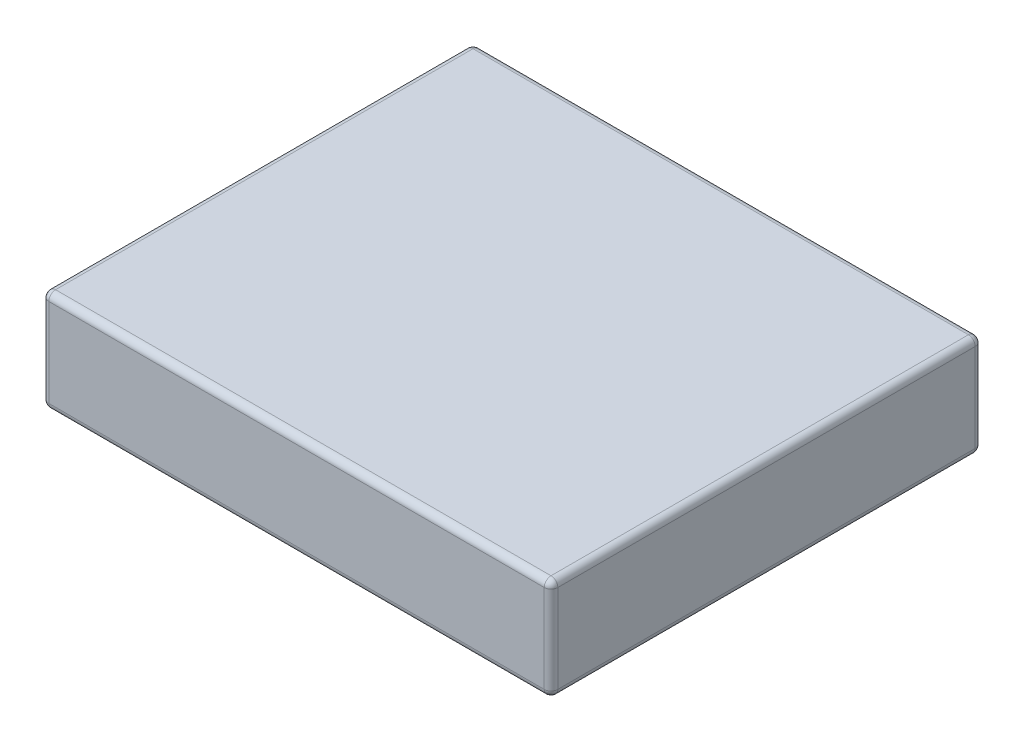
ISO-10303-21;
HEADER;
FILE_DESCRIPTION(('STEP AP214'),'2;1');
FILE_NAME('part.step','',(''),(''),'','','');
FILE_SCHEMA(('AUTOMOTIVE_DESIGN { 1 0 10303 214 1 1 1 1 }'));
ENDSEC;
DATA;
#1=APPLICATION_CONTEXT('core data for automotive mechanical design processes');
#2=APPLICATION_PROTOCOL_DEFINITION('international standard','automotive_design',2000,#1);
#3=PRODUCT_CONTEXT('',#1,'mechanical');
#4=PRODUCT('Part','Part','',(#3));
#5=PRODUCT_RELATED_PRODUCT_CATEGORY('part','',(#4));
#6=PRODUCT_DEFINITION_FORMATION('','',#4);
#7=PRODUCT_DEFINITION_CONTEXT('part definition',#1,'design');
#8=PRODUCT_DEFINITION('design','',#6,#7);
#9=PRODUCT_DEFINITION_SHAPE('','',#8);
#10=(LENGTH_UNIT() NAMED_UNIT(*) SI_UNIT(.MILLI.,.METRE.));
#11=(NAMED_UNIT(*) PLANE_ANGLE_UNIT() SI_UNIT($,.RADIAN.));
#12=(NAMED_UNIT(*) SI_UNIT($,.STERADIAN.) SOLID_ANGLE_UNIT());
#13=UNCERTAINTY_MEASURE_WITH_UNIT(LENGTH_MEASURE(1.E-05),#10,'distance_accuracy_value','');
#14=(GEOMETRIC_REPRESENTATION_CONTEXT(3) GLOBAL_UNCERTAINTY_ASSIGNED_CONTEXT((#13)) GLOBAL_UNIT_ASSIGNED_CONTEXT((#10,
#11,#12)) REPRESENTATION_CONTEXT('',''));
#15=CARTESIAN_POINT('',(0.,0.,0.));
#16=DIRECTION('',(0.,0.,1.));
#17=DIRECTION('',(1.,0.,0.));
#18=AXIS2_PLACEMENT_3D('',#15,#16,#17);
#19=CARTESIAN_POINT('',(-15.,-3.,-12.7));
#20=DIRECTION('',(-1.,0.,0.));
#21=DIRECTION('',(0.,0.,1.));
#22=AXIS2_PLACEMENT_3D('',#19,#20,#21);
#23=PLANE('',#22);
#24=DIRECTION('',(0.,1.,0.));
#25=VECTOR('',#24,1.);
#26=CARTESIAN_POINT('',(-15.,-3.,12.3));
#27=LINE('',#26,#25);
#28=CARTESIAN_POINT('',(-15.,-2.6,12.3));
#29=VERTEX_POINT('',#28);
#30=CARTESIAN_POINT('',(-15.,2.6,12.3));
#31=VERTEX_POINT('',#30);
#32=EDGE_CURVE('E140',#29,#31,#27,.T.);
#33=ORIENTED_EDGE('',*,*,#32,.T.);
#34=DIRECTION('',(0.,0.,1.));
#35=VECTOR('',#34,1.);
#36=CARTESIAN_POINT('',(-15.,2.6,-12.7));
#37=LINE('',#36,#35);
#38=CARTESIAN_POINT('',(-15.,2.6,-12.3));
#39=VERTEX_POINT('',#38);
#40=EDGE_CURVE('E188',#31,#39,#37,.F.);
#41=ORIENTED_EDGE('',*,*,#40,.T.);
#42=DIRECTION('',(0.,1.,0.));
#43=VECTOR('',#42,1.);
#44=CARTESIAN_POINT('',(-15.,-3.,-12.3));
#45=LINE('',#44,#43);
#46=CARTESIAN_POINT('',(-15.,-2.6,-12.3));
#47=VERTEX_POINT('',#46);
#48=EDGE_CURVE('E185',#39,#47,#45,.F.);
#49=ORIENTED_EDGE('',*,*,#48,.T.);
#50=DIRECTION('',(0.,0.,1.));
#51=VECTOR('',#50,1.);
#52=CARTESIAN_POINT('',(-15.,-2.6,12.7));
#53=LINE('',#52,#51);
#54=EDGE_CURVE('E182',#47,#29,#53,.T.);
#55=ORIENTED_EDGE('',*,*,#54,.T.);
#56=EDGE_LOOP('',(#33,#41,#49,#55));
#57=FACE_BOUND('',#56,.T.);
#58=ADVANCED_FACE('F33',(#57),#23,.T.);
#59=CARTESIAN_POINT('',(-15.,-3.,-12.7));
#60=DIRECTION('',(0.,0.,-1.));
#61=DIRECTION('',(-1.,0.,0.));
#62=AXIS2_PLACEMENT_3D('',#59,#60,#61);
#63=PLANE('',#62);
#64=DIRECTION('',(0.,1.,0.));
#65=VECTOR('',#64,1.);
#66=CARTESIAN_POINT('',(-14.6,-3.,-12.7));
#67=LINE('',#66,#65);
#68=CARTESIAN_POINT('',(-14.6,-2.6,-12.7));
#69=VERTEX_POINT('',#68);
#70=CARTESIAN_POINT('',(-14.6,2.6,-12.7));
#71=VERTEX_POINT('',#70);
#72=EDGE_CURVE('E175',#69,#71,#67,.T.);
#73=ORIENTED_EDGE('',*,*,#72,.T.);
#74=DIRECTION('',(-1.,0.,0.));
#75=VECTOR('',#74,1.);
#76=CARTESIAN_POINT('',(-15.,2.6,-12.7));
#77=LINE('',#76,#75);
#78=CARTESIAN_POINT('',(14.6,2.6,-12.7));
#79=VERTEX_POINT('',#78);
#80=EDGE_CURVE('E180',#71,#79,#77,.F.);
#81=ORIENTED_EDGE('',*,*,#80,.T.);
#82=DIRECTION('',(0.,1.,0.));
#83=VECTOR('',#82,1.);
#84=CARTESIAN_POINT('',(14.6,-3.,-12.7));
#85=LINE('',#84,#83);
#86=CARTESIAN_POINT('',(14.6,-2.6,-12.7));
#87=VERTEX_POINT('',#86);
#88=EDGE_CURVE('E177',#79,#87,#85,.F.);
#89=ORIENTED_EDGE('',*,*,#88,.T.);
#90=DIRECTION('',(-1.,0.,0.));
#91=VECTOR('',#90,1.);
#92=CARTESIAN_POINT('',(-15.,-2.6,-12.7));
#93=LINE('',#92,#91);
#94=EDGE_CURVE('E173',#87,#69,#93,.T.);
#95=ORIENTED_EDGE('',*,*,#94,.T.);
#96=EDGE_LOOP('',(#73,#81,#89,#95));
#97=FACE_BOUND('',#96,.T.);
#98=ADVANCED_FACE('F294',(#97),#63,.T.);
#99=CARTESIAN_POINT('',(15.,-3.,-12.7));
#100=DIRECTION('',(1.,0.,0.));
#101=DIRECTION('',(0.,0.,-1.));
#102=AXIS2_PLACEMENT_3D('',#99,#100,#101);
#103=PLANE('',#102);
#104=DIRECTION('',(0.,1.,0.));
#105=VECTOR('',#104,1.);
#106=CARTESIAN_POINT('',(15.,-3.,-12.3));
#107=LINE('',#106,#105);
#108=CARTESIAN_POINT('',(15.,-2.6,-12.3));
#109=VERTEX_POINT('',#108);
#110=CARTESIAN_POINT('',(15.,2.6,-12.3));
#111=VERTEX_POINT('',#110);
#112=EDGE_CURVE('E166',#109,#111,#107,.T.);
#113=ORIENTED_EDGE('',*,*,#112,.T.);
#114=DIRECTION('',(0.,0.,-1.));
#115=VECTOR('',#114,1.);
#116=CARTESIAN_POINT('',(15.,2.6,-12.7));
#117=LINE('',#116,#115);
#118=CARTESIAN_POINT('',(15.,2.6,12.3));
#119=VERTEX_POINT('',#118);
#120=EDGE_CURVE('E171',#111,#119,#117,.F.);
#121=ORIENTED_EDGE('',*,*,#120,.T.);
#122=DIRECTION('',(0.,1.,0.));
#123=VECTOR('',#122,1.);
#124=CARTESIAN_POINT('',(15.,-3.,12.3));
#125=LINE('',#124,#123);
#126=CARTESIAN_POINT('',(15.,-2.6,12.3));
#127=VERTEX_POINT('',#126);
#128=EDGE_CURVE('E168',#119,#127,#125,.F.);
#129=ORIENTED_EDGE('',*,*,#128,.T.);
#130=DIRECTION('',(0.,0.,-1.));
#131=VECTOR('',#130,1.);
#132=CARTESIAN_POINT('',(15.,-2.6,-12.7));
#133=LINE('',#132,#131);
#134=EDGE_CURVE('E164',#127,#109,#133,.T.);
#135=ORIENTED_EDGE('',*,*,#134,.T.);
#136=EDGE_LOOP('',(#113,#121,#129,#135));
#137=FACE_BOUND('',#136,.T.);
#138=ADVANCED_FACE('F285',(#137),#103,.T.);
#139=CARTESIAN_POINT('',(-15.,-3.,12.7));
#140=DIRECTION('',(0.,0.,1.));
#141=DIRECTION('',(1.,0.,0.));
#142=AXIS2_PLACEMENT_3D('',#139,#140,#141);
#143=PLANE('',#142);
#144=DIRECTION('',(0.,1.,0.));
#145=VECTOR('',#144,1.);
#146=CARTESIAN_POINT('',(14.6,-3.,12.7));
#147=LINE('',#146,#145);
#148=CARTESIAN_POINT('',(14.6,-2.6,12.7));
#149=VERTEX_POINT('',#148);
#150=CARTESIAN_POINT('',(14.6,2.6,12.7));
#151=VERTEX_POINT('',#150);
#152=EDGE_CURVE('E133',#149,#151,#147,.T.);
#153=ORIENTED_EDGE('',*,*,#152,.T.);
#154=DIRECTION('',(1.,0.,0.));
#155=VECTOR('',#154,1.);
#156=CARTESIAN_POINT('',(-15.,2.6,12.7));
#157=LINE('',#156,#155);
#158=CARTESIAN_POINT('',(-14.6,2.6,12.7));
#159=VERTEX_POINT('',#158);
#160=EDGE_CURVE('E129',#151,#159,#157,.F.);
#161=ORIENTED_EDGE('',*,*,#160,.T.);
#162=DIRECTION('',(0.,1.,0.));
#163=VECTOR('',#162,1.);
#164=CARTESIAN_POINT('',(-14.6,-3.,12.7));
#165=LINE('',#164,#163);
#166=CARTESIAN_POINT('',(-14.6,-2.6,12.7));
#167=VERTEX_POINT('',#166);
#168=EDGE_CURVE('E121',#159,#167,#165,.F.);
#169=ORIENTED_EDGE('',*,*,#168,.T.);
#170=DIRECTION('',(1.,0.,0.));
#171=VECTOR('',#170,1.);
#172=CARTESIAN_POINT('',(15.,-2.6,12.7));
#173=LINE('',#172,#171);
#174=EDGE_CURVE('E126',#167,#149,#173,.T.);
#175=ORIENTED_EDGE('',*,*,#174,.T.);
#176=EDGE_LOOP('',(#153,#161,#169,#175));
#177=FACE_BOUND('',#176,.T.);
#178=ADVANCED_FACE('F124',(#177),#143,.T.);
#179=CARTESIAN_POINT('',(0.,-3.,0.));
#180=DIRECTION('',(0.,1.,0.));
#181=DIRECTION('',(0.,0.,1.));
#182=AXIS2_PLACEMENT_3D('',#179,#180,#181);
#183=PLANE('',#182);
#184=DIRECTION('',(0.,0.,-1.));
#185=VECTOR('',#184,1.);
#186=CARTESIAN_POINT('',(14.6,-3.,12.7));
#187=LINE('',#186,#185);
#188=CARTESIAN_POINT('',(14.6,-3.,-12.3));
#189=VERTEX_POINT('',#188);
#190=CARTESIAN_POINT('',(14.6,-3.,12.3));
#191=VERTEX_POINT('',#190);
#192=EDGE_CURVE('E42',#189,#191,#187,.F.);
#193=ORIENTED_EDGE('',*,*,#192,.T.);
#194=DIRECTION('',(1.,0.,0.));
#195=VECTOR('',#194,1.);
#196=CARTESIAN_POINT('',(-15.,-3.,12.3));
#197=LINE('',#196,#195);
#198=CARTESIAN_POINT('',(-14.6,-3.,12.3));
#199=VERTEX_POINT('',#198);
#200=EDGE_CURVE('E11',#191,#199,#197,.F.);
#201=ORIENTED_EDGE('',*,*,#200,.T.);
#202=DIRECTION('',(0.,0.,1.));
#203=VECTOR('',#202,1.);
#204=CARTESIAN_POINT('',(-14.6,-3.,-12.7));
#205=LINE('',#204,#203);
#206=CARTESIAN_POINT('',(-14.6,-3.,-12.3));
#207=VERTEX_POINT('',#206);
#208=EDGE_CURVE('E199',#199,#207,#205,.F.);
#209=ORIENTED_EDGE('',*,*,#208,.T.);
#210=DIRECTION('',(-1.,0.,0.));
#211=VECTOR('',#210,1.);
#212=CARTESIAN_POINT('',(15.,-3.,-12.3));
#213=LINE('',#212,#211);
#214=EDGE_CURVE('E53',#207,#189,#213,.F.);
#215=ORIENTED_EDGE('',*,*,#214,.T.);
#216=EDGE_LOOP('',(#193,#201,#209,#215));
#217=FACE_BOUND('',#216,.T.);
#218=ADVANCED_FACE('F484',(#217),#183,.F.);
#219=CARTESIAN_POINT('',(0.,3.,0.));
#220=DIRECTION('',(0.,1.,0.));
#221=DIRECTION('',(0.,0.,1.));
#222=AXIS2_PLACEMENT_3D('',#219,#220,#221);
#223=PLANE('',#222);
#224=DIRECTION('',(0.,0.,-1.));
#225=VECTOR('',#224,1.);
#226=CARTESIAN_POINT('',(14.6,3.,0.));
#227=LINE('',#226,#225);
#228=CARTESIAN_POINT('',(14.6,3.,12.3));
#229=VERTEX_POINT('',#228);
#230=CARTESIAN_POINT('',(14.6,3.,-12.3));
#231=VERTEX_POINT('',#230);
#232=EDGE_CURVE('E194',#229,#231,#227,.T.);
#233=ORIENTED_EDGE('',*,*,#232,.T.);
#234=DIRECTION('',(-1.,0.,0.));
#235=VECTOR('',#234,1.);
#236=CARTESIAN_POINT('',(0.,3.,-12.3));
#237=LINE('',#236,#235);
#238=CARTESIAN_POINT('',(-14.6,3.,-12.3));
#239=VERTEX_POINT('',#238);
#240=EDGE_CURVE('E196',#231,#239,#237,.T.);
#241=ORIENTED_EDGE('',*,*,#240,.T.);
#242=DIRECTION('',(0.,0.,1.));
#243=VECTOR('',#242,1.);
#244=CARTESIAN_POINT('',(-14.6,3.,0.));
#245=LINE('',#244,#243);
#246=CARTESIAN_POINT('',(-14.6,3.,12.3));
#247=VERTEX_POINT('',#246);
#248=EDGE_CURVE('E190',#239,#247,#245,.T.);
#249=ORIENTED_EDGE('',*,*,#248,.T.);
#250=DIRECTION('',(1.,0.,0.));
#251=VECTOR('',#250,1.);
#252=CARTESIAN_POINT('',(0.,3.,12.3));
#253=LINE('',#252,#251);
#254=EDGE_CURVE('E192',#247,#229,#253,.T.);
#255=ORIENTED_EDGE('',*,*,#254,.T.);
#256=EDGE_LOOP('',(#233,#241,#249,#255));
#257=FACE_BOUND('',#256,.T.);
#258=ADVANCED_FACE('F267',(#257),#223,.T.);
#259=CARTESIAN_POINT('',(-14.6,-3.,-12.3));
#260=DIRECTION('',(0.,1.,0.));
#261=DIRECTION('',(0.,0.,1.));
#262=AXIS2_PLACEMENT_3D('',#259,#260,#261);
#263=CYLINDRICAL_SURFACE('',#262,0.4);
#264=CARTESIAN_POINT('',(-14.6,-2.6,-12.3));
#265=DIRECTION('',(0.,-1.,0.));
#266=DIRECTION('',(0.,0.,-1.));
#267=AXIS2_PLACEMENT_3D('',#264,#265,#266);
#268=CIRCLE('',#267,0.4);
#269=EDGE_CURVE('E37',#47,#69,#268,.T.);
#270=ORIENTED_EDGE('',*,*,#269,.F.);
#271=ORIENTED_EDGE('',*,*,#48,.F.);
#272=CARTESIAN_POINT('',(-14.6,2.6,-12.3));
#273=DIRECTION('',(0.,1.,0.));
#274=DIRECTION('',(0.,0.,1.));
#275=AXIS2_PLACEMENT_3D('',#272,#273,#274);
#276=CIRCLE('',#275,0.4);
#277=EDGE_CURVE('E160',#71,#39,#276,.T.);
#278=ORIENTED_EDGE('',*,*,#277,.F.);
#279=ORIENTED_EDGE('',*,*,#72,.F.);
#280=EDGE_LOOP('',(#270,#271,#278,#279));
#281=FACE_BOUND('',#280,.T.);
#282=ADVANCED_FACE('F35',(#281),#263,.T.);
#283=CARTESIAN_POINT('',(-14.6,-2.6,-12.3));
#284=DIRECTION('',(0.,0.,1.));
#285=DIRECTION('',(1.,0.,0.));
#286=AXIS2_PLACEMENT_3D('',#283,#284,#285);
#287=SPHERICAL_SURFACE('',#286,0.4);
#288=CARTESIAN_POINT('',(-14.6,-2.6,-12.3));
#289=DIRECTION('',(0.,0.,-1.));
#290=DIRECTION('',(-1.,0.,0.));
#291=AXIS2_PLACEMENT_3D('',#288,#289,#290);
#292=CIRCLE('',#291,0.4);
#293=EDGE_CURVE('E246',#47,#207,#292,.F.);
#294=ORIENTED_EDGE('',*,*,#293,.F.);
#295=ORIENTED_EDGE('',*,*,#269,.T.);
#296=CARTESIAN_POINT('',(-14.6,-2.6,-12.3));
#297=DIRECTION('',(-1.,0.,0.));
#298=DIRECTION('',(0.,0.,1.));
#299=AXIS2_PLACEMENT_3D('',#296,#297,#298);
#300=CIRCLE('',#299,0.4);
#301=EDGE_CURVE('E249',#207,#69,#300,.F.);
#302=ORIENTED_EDGE('',*,*,#301,.F.);
#303=EDGE_LOOP('',(#294,#295,#302));
#304=FACE_BOUND('',#303,.T.);
#305=ADVANCED_FACE('F299',(#304),#287,.T.);
#306=CARTESIAN_POINT('',(-14.6,2.6,-12.3));
#307=DIRECTION('',(0.,0.,1.));
#308=DIRECTION('',(1.,0.,0.));
#309=AXIS2_PLACEMENT_3D('',#306,#307,#308);
#310=SPHERICAL_SURFACE('',#309,0.4);
#311=CARTESIAN_POINT('',(-14.6,2.6,-12.3));
#312=DIRECTION('',(-1.,0.,0.));
#313=DIRECTION('',(0.,0.,1.));
#314=AXIS2_PLACEMENT_3D('',#311,#312,#313);
#315=CIRCLE('',#314,0.4);
#316=EDGE_CURVE('E240',#71,#239,#315,.F.);
#317=ORIENTED_EDGE('',*,*,#316,.F.);
#318=ORIENTED_EDGE('',*,*,#277,.T.);
#319=CARTESIAN_POINT('',(-14.6,2.6,-12.3));
#320=DIRECTION('',(0.,0.,-1.));
#321=DIRECTION('',(-1.,0.,0.));
#322=AXIS2_PLACEMENT_3D('',#319,#320,#321);
#323=CIRCLE('',#322,0.4);
#324=EDGE_CURVE('E243',#239,#39,#323,.F.);
#325=ORIENTED_EDGE('',*,*,#324,.F.);
#326=EDGE_LOOP('',(#317,#318,#325));
#327=FACE_BOUND('',#326,.T.);
#328=ADVANCED_FACE('F256',(#327),#310,.T.);
#329=CARTESIAN_POINT('',(-15.,-2.6,-12.3));
#330=DIRECTION('',(1.,0.,0.));
#331=DIRECTION('',(0.,0.,-1.));
#332=AXIS2_PLACEMENT_3D('',#329,#330,#331);
#333=CYLINDRICAL_SURFACE('',#332,0.4);
#334=ORIENTED_EDGE('',*,*,#301,.T.);
#335=ORIENTED_EDGE('',*,*,#94,.F.);
#336=CARTESIAN_POINT('',(14.6,-2.6,-12.3));
#337=DIRECTION('',(1.,0.,0.));
#338=DIRECTION('',(0.,0.,-1.));
#339=AXIS2_PLACEMENT_3D('',#336,#337,#338);
#340=CIRCLE('',#339,0.4);
#341=EDGE_CURVE('E235',#189,#87,#340,.T.);
#342=ORIENTED_EDGE('',*,*,#341,.F.);
#343=ORIENTED_EDGE('',*,*,#214,.F.);
#344=EDGE_LOOP('',(#334,#335,#342,#343));
#345=FACE_BOUND('',#344,.T.);
#346=ADVANCED_FACE('F301',(#345),#333,.T.);
#347=CARTESIAN_POINT('',(-14.6,-2.6,-12.7));
#348=DIRECTION('',(0.,0.,-1.));
#349=DIRECTION('',(-1.,0.,0.));
#350=AXIS2_PLACEMENT_3D('',#347,#348,#349);
#351=CYLINDRICAL_SURFACE('',#350,0.4);
#352=ORIENTED_EDGE('',*,*,#293,.T.);
#353=ORIENTED_EDGE('',*,*,#208,.F.);
#354=CARTESIAN_POINT('',(-14.6,-2.6,12.3));
#355=DIRECTION('',(0.,0.,1.));
#356=DIRECTION('',(0.,-1.,0.));
#357=AXIS2_PLACEMENT_3D('',#354,#355,#356);
#358=CIRCLE('',#357,0.4);
#359=EDGE_CURVE('E144',#29,#199,#358,.T.);
#360=ORIENTED_EDGE('',*,*,#359,.F.);
#361=ORIENTED_EDGE('',*,*,#54,.F.);
#362=EDGE_LOOP('',(#352,#353,#360,#361));
#363=FACE_BOUND('',#362,.T.);
#364=ADVANCED_FACE('F442',(#363),#351,.T.);
#365=CARTESIAN_POINT('',(-14.6,-3.,12.3));
#366=DIRECTION('',(0.,1.,0.));
#367=DIRECTION('',(0.,0.,1.));
#368=AXIS2_PLACEMENT_3D('',#365,#366,#367);
#369=CYLINDRICAL_SURFACE('',#368,0.4);
#370=CARTESIAN_POINT('',(-14.6,2.6,12.3));
#371=DIRECTION('',(0.,1.,0.));
#372=DIRECTION('',(0.,0.,1.));
#373=AXIS2_PLACEMENT_3D('',#370,#371,#372);
#374=CIRCLE('',#373,0.4);
#375=EDGE_CURVE('E145',#31,#159,#374,.T.);
#376=ORIENTED_EDGE('',*,*,#375,.F.);
#377=ORIENTED_EDGE('',*,*,#32,.F.);
#378=CARTESIAN_POINT('',(-14.6,-2.6,12.3));
#379=DIRECTION('',(0.,-1.,0.));
#380=DIRECTION('',(0.,0.,-1.));
#381=AXIS2_PLACEMENT_3D('',#378,#379,#380);
#382=CIRCLE('',#381,0.4);
#383=EDGE_CURVE('E137',#167,#29,#382,.T.);
#384=ORIENTED_EDGE('',*,*,#383,.F.);
#385=ORIENTED_EDGE('',*,*,#168,.F.);
#386=EDGE_LOOP('',(#376,#377,#384,#385));
#387=FACE_BOUND('',#386,.T.);
#388=ADVANCED_FACE('F139',(#387),#369,.T.);
#389=CARTESIAN_POINT('',(-14.6,2.6,0.));
#390=DIRECTION('',(0.,0.,1.));
#391=DIRECTION('',(1.,0.,0.));
#392=AXIS2_PLACEMENT_3D('',#389,#390,#391);
#393=CYLINDRICAL_SURFACE('',#392,0.4);
#394=ORIENTED_EDGE('',*,*,#324,.T.);
#395=ORIENTED_EDGE('',*,*,#40,.F.);
#396=CARTESIAN_POINT('',(-14.6,2.6,12.3));
#397=DIRECTION('',(0.,0.,1.));
#398=DIRECTION('',(1.,0.,0.));
#399=AXIS2_PLACEMENT_3D('',#396,#397,#398);
#400=CIRCLE('',#399,0.4);
#401=EDGE_CURVE('E230',#247,#31,#400,.T.);
#402=ORIENTED_EDGE('',*,*,#401,.F.);
#403=ORIENTED_EDGE('',*,*,#248,.F.);
#404=EDGE_LOOP('',(#394,#395,#402,#403));
#405=FACE_BOUND('',#404,.T.);
#406=ADVANCED_FACE('F263',(#405),#393,.T.);
#407=CARTESIAN_POINT('',(0.,2.6,-12.3));
#408=DIRECTION('',(-1.,0.,0.));
#409=DIRECTION('',(0.,0.,1.));
#410=AXIS2_PLACEMENT_3D('',#407,#408,#409);
#411=CYLINDRICAL_SURFACE('',#410,0.4);
#412=ORIENTED_EDGE('',*,*,#316,.T.);
#413=ORIENTED_EDGE('',*,*,#240,.F.);
#414=CARTESIAN_POINT('',(14.6,2.6,-12.3));
#415=DIRECTION('',(1.,0.,0.));
#416=DIRECTION('',(0.,0.,-1.));
#417=AXIS2_PLACEMENT_3D('',#414,#415,#416);
#418=CIRCLE('',#417,0.4);
#419=EDGE_CURVE('E227',#79,#231,#418,.T.);
#420=ORIENTED_EDGE('',*,*,#419,.F.);
#421=ORIENTED_EDGE('',*,*,#80,.F.);
#422=EDGE_LOOP('',(#412,#413,#420,#421));
#423=FACE_BOUND('',#422,.T.);
#424=ADVANCED_FACE('F273',(#423),#411,.T.);
#425=CARTESIAN_POINT('',(14.6,-3.,-12.3));
#426=DIRECTION('',(0.,1.,0.));
#427=DIRECTION('',(0.,0.,1.));
#428=AXIS2_PLACEMENT_3D('',#425,#426,#427);
#429=CYLINDRICAL_SURFACE('',#428,0.4);
#430=CARTESIAN_POINT('',(14.6,-2.6,-12.3));
#431=DIRECTION('',(0.,-1.,0.));
#432=DIRECTION('',(0.,0.,-1.));
#433=AXIS2_PLACEMENT_3D('',#430,#431,#432);
#434=CIRCLE('',#433,0.4);
#435=EDGE_CURVE('E237',#87,#109,#434,.T.);
#436=ORIENTED_EDGE('',*,*,#435,.F.);
#437=ORIENTED_EDGE('',*,*,#88,.F.);
#438=CARTESIAN_POINT('',(14.6,2.6,-12.3));
#439=DIRECTION('',(0.,1.,0.));
#440=DIRECTION('',(0.,0.,1.));
#441=AXIS2_PLACEMENT_3D('',#438,#439,#440);
#442=CIRCLE('',#441,0.4);
#443=EDGE_CURVE('E224',#111,#79,#442,.T.);
#444=ORIENTED_EDGE('',*,*,#443,.F.);
#445=ORIENTED_EDGE('',*,*,#112,.F.);
#446=EDGE_LOOP('',(#436,#437,#444,#445));
#447=FACE_BOUND('',#446,.T.);
#448=ADVANCED_FACE('F291',(#447),#429,.T.);
#449=CARTESIAN_POINT('',(14.6,-2.6,-12.3));
#450=DIRECTION('',(0.,0.,1.));
#451=DIRECTION('',(1.,0.,0.));
#452=AXIS2_PLACEMENT_3D('',#449,#450,#451);
#453=SPHERICAL_SURFACE('',#452,0.4);
#454=ORIENTED_EDGE('',*,*,#341,.T.);
#455=ORIENTED_EDGE('',*,*,#435,.T.);
#456=CARTESIAN_POINT('',(14.6,-2.6,-12.3));
#457=DIRECTION('',(0.,0.,-1.));
#458=DIRECTION('',(-1.,0.,0.));
#459=AXIS2_PLACEMENT_3D('',#456,#457,#458);
#460=CIRCLE('',#459,0.4);
#461=EDGE_CURVE('E151',#189,#109,#460,.F.);
#462=ORIENTED_EDGE('',*,*,#461,.F.);
#463=EDGE_LOOP('',(#454,#455,#462));
#464=FACE_BOUND('',#463,.T.);
#465=ADVANCED_FACE('F304',(#464),#453,.T.);
#466=CARTESIAN_POINT('',(-14.6,-2.6,12.3));
#467=DIRECTION('',(0.,0.,1.));
#468=DIRECTION('',(1.,0.,0.));
#469=AXIS2_PLACEMENT_3D('',#466,#467,#468);
#470=SPHERICAL_SURFACE('',#469,0.4);
#471=ORIENTED_EDGE('',*,*,#383,.T.);
#472=ORIENTED_EDGE('',*,*,#359,.T.);
#473=CARTESIAN_POINT('',(-14.6,-2.6,12.3));
#474=DIRECTION('',(-1.,0.,0.));
#475=DIRECTION('',(0.,0.,1.));
#476=AXIS2_PLACEMENT_3D('',#473,#474,#475);
#477=CIRCLE('',#476,0.4);
#478=EDGE_CURVE('E147',#167,#199,#477,.F.);
#479=ORIENTED_EDGE('',*,*,#478,.F.);
#480=EDGE_LOOP('',(#471,#472,#479));
#481=FACE_BOUND('',#480,.T.);
#482=ADVANCED_FACE('F148',(#481),#470,.T.);
#483=CARTESIAN_POINT('',(-14.6,2.6,12.3));
#484=DIRECTION('',(0.,0.,1.));
#485=DIRECTION('',(1.,0.,0.));
#486=AXIS2_PLACEMENT_3D('',#483,#484,#485);
#487=SPHERICAL_SURFACE('',#486,0.4);
#488=ORIENTED_EDGE('',*,*,#401,.T.);
#489=ORIENTED_EDGE('',*,*,#375,.T.);
#490=CARTESIAN_POINT('',(-14.6,2.6,12.3));
#491=DIRECTION('',(-1.,0.,0.));
#492=DIRECTION('',(0.,0.,1.));
#493=AXIS2_PLACEMENT_3D('',#490,#491,#492);
#494=CIRCLE('',#493,0.4);
#495=EDGE_CURVE('E152',#247,#159,#494,.F.);
#496=ORIENTED_EDGE('',*,*,#495,.F.);
#497=EDGE_LOOP('',(#488,#489,#496));
#498=FACE_BOUND('',#497,.T.);
#499=ADVANCED_FACE('F319',(#498),#487,.T.);
#500=CARTESIAN_POINT('',(14.6,2.6,-12.3));
#501=DIRECTION('',(0.,0.,1.));
#502=DIRECTION('',(1.,0.,0.));
#503=AXIS2_PLACEMENT_3D('',#500,#501,#502);
#504=SPHERICAL_SURFACE('',#503,0.4);
#505=ORIENTED_EDGE('',*,*,#443,.T.);
#506=ORIENTED_EDGE('',*,*,#419,.T.);
#507=CARTESIAN_POINT('',(14.6,2.6,-12.3));
#508=DIRECTION('',(0.,0.,-1.));
#509=DIRECTION('',(-1.,0.,0.));
#510=AXIS2_PLACEMENT_3D('',#507,#508,#509);
#511=CIRCLE('',#510,0.4);
#512=EDGE_CURVE('E217',#111,#231,#511,.F.);
#513=ORIENTED_EDGE('',*,*,#512,.F.);
#514=EDGE_LOOP('',(#505,#506,#513));
#515=FACE_BOUND('',#514,.T.);
#516=ADVANCED_FACE('F276',(#515),#504,.T.);
#517=CARTESIAN_POINT('',(14.6,-2.6,-12.7));
#518=DIRECTION('',(0.,0.,1.));
#519=DIRECTION('',(1.,0.,0.));
#520=AXIS2_PLACEMENT_3D('',#517,#518,#519);
#521=CYLINDRICAL_SURFACE('',#520,0.4);
#522=ORIENTED_EDGE('',*,*,#461,.T.);
#523=ORIENTED_EDGE('',*,*,#134,.F.);
#524=CARTESIAN_POINT('',(14.6,-2.6,12.3));
#525=DIRECTION('',(0.,0.,1.));
#526=DIRECTION('',(1.,0.,0.));
#527=AXIS2_PLACEMENT_3D('',#524,#525,#526);
#528=CIRCLE('',#527,0.4);
#529=EDGE_CURVE('E214',#191,#127,#528,.T.);
#530=ORIENTED_EDGE('',*,*,#529,.F.);
#531=ORIENTED_EDGE('',*,*,#192,.F.);
#532=EDGE_LOOP('',(#522,#523,#530,#531));
#533=FACE_BOUND('',#532,.T.);
#534=ADVANCED_FACE('F307',(#533),#521,.T.);
#535=CARTESIAN_POINT('',(-15.,-2.6,12.3));
#536=DIRECTION('',(-1.,0.,0.));
#537=DIRECTION('',(0.,0.,1.));
#538=AXIS2_PLACEMENT_3D('',#535,#536,#537);
#539=CYLINDRICAL_SURFACE('',#538,0.4);
#540=ORIENTED_EDGE('',*,*,#478,.T.);
#541=ORIENTED_EDGE('',*,*,#200,.F.);
#542=CARTESIAN_POINT('',(14.6,-2.6,12.3));
#543=DIRECTION('',(1.,0.,0.));
#544=DIRECTION('',(0.,1.,0.));
#545=AXIS2_PLACEMENT_3D('',#542,#543,#544);
#546=CIRCLE('',#545,0.4);
#547=EDGE_CURVE('E156',#149,#191,#546,.T.);
#548=ORIENTED_EDGE('',*,*,#547,.F.);
#549=ORIENTED_EDGE('',*,*,#174,.F.);
#550=EDGE_LOOP('',(#540,#541,#548,#549));
#551=FACE_BOUND('',#550,.T.);
#552=ADVANCED_FACE('F154',(#551),#539,.T.);
#553=CARTESIAN_POINT('',(0.,2.6,12.3));
#554=DIRECTION('',(1.,0.,0.));
#555=DIRECTION('',(0.,0.,-1.));
#556=AXIS2_PLACEMENT_3D('',#553,#554,#555);
#557=CYLINDRICAL_SURFACE('',#556,0.4);
#558=ORIENTED_EDGE('',*,*,#495,.T.);
#559=ORIENTED_EDGE('',*,*,#160,.F.);
#560=CARTESIAN_POINT('',(14.6,2.6,12.3));
#561=DIRECTION('',(1.,0.,0.));
#562=DIRECTION('',(0.,0.,-1.));
#563=AXIS2_PLACEMENT_3D('',#560,#561,#562);
#564=CIRCLE('',#563,0.4);
#565=EDGE_CURVE('E210',#229,#151,#564,.T.);
#566=ORIENTED_EDGE('',*,*,#565,.F.);
#567=ORIENTED_EDGE('',*,*,#254,.F.);
#568=EDGE_LOOP('',(#558,#559,#566,#567));
#569=FACE_BOUND('',#568,.T.);
#570=ADVANCED_FACE('F317',(#569),#557,.T.);
#571=CARTESIAN_POINT('',(14.6,2.6,0.));
#572=DIRECTION('',(0.,0.,-1.));
#573=DIRECTION('',(-1.,0.,0.));
#574=AXIS2_PLACEMENT_3D('',#571,#572,#573);
#575=CYLINDRICAL_SURFACE('',#574,0.4);
#576=ORIENTED_EDGE('',*,*,#512,.T.);
#577=ORIENTED_EDGE('',*,*,#232,.F.);
#578=CARTESIAN_POINT('',(14.6,2.6,12.3));
#579=DIRECTION('',(0.,0.,1.));
#580=DIRECTION('',(1.,0.,0.));
#581=AXIS2_PLACEMENT_3D('',#578,#579,#580);
#582=CIRCLE('',#581,0.4);
#583=EDGE_CURVE('E207',#119,#229,#582,.T.);
#584=ORIENTED_EDGE('',*,*,#583,.F.);
#585=ORIENTED_EDGE('',*,*,#120,.F.);
#586=EDGE_LOOP('',(#576,#577,#584,#585));
#587=FACE_BOUND('',#586,.T.);
#588=ADVANCED_FACE('F280',(#587),#575,.T.);
#589=CARTESIAN_POINT('',(14.6,-2.6,12.3));
#590=DIRECTION('',(0.,0.,1.));
#591=DIRECTION('',(1.,0.,0.));
#592=AXIS2_PLACEMENT_3D('',#589,#590,#591);
#593=SPHERICAL_SURFACE('',#592,0.4);
#594=ORIENTED_EDGE('',*,*,#547,.T.);
#595=ORIENTED_EDGE('',*,*,#529,.T.);
#596=CARTESIAN_POINT('',(14.6,-2.6,12.3));
#597=DIRECTION('',(0.,-1.,0.));
#598=DIRECTION('',(0.,0.,-1.));
#599=AXIS2_PLACEMENT_3D('',#596,#597,#598);
#600=CIRCLE('',#599,0.4);
#601=EDGE_CURVE('E205',#149,#127,#600,.F.);
#602=ORIENTED_EDGE('',*,*,#601,.F.);
#603=EDGE_LOOP('',(#594,#595,#602));
#604=FACE_BOUND('',#603,.T.);
#605=ADVANCED_FACE('F309',(#604),#593,.T.);
#606=CARTESIAN_POINT('',(14.6,2.6,12.3));
#607=DIRECTION('',(0.,0.,1.));
#608=DIRECTION('',(1.,0.,0.));
#609=AXIS2_PLACEMENT_3D('',#606,#607,#608);
#610=SPHERICAL_SURFACE('',#609,0.4);
#611=ORIENTED_EDGE('',*,*,#583,.T.);
#612=ORIENTED_EDGE('',*,*,#565,.T.);
#613=CARTESIAN_POINT('',(14.6,2.6,12.3));
#614=DIRECTION('',(0.,1.,0.));
#615=DIRECTION('',(0.,0.,1.));
#616=AXIS2_PLACEMENT_3D('',#613,#614,#615);
#617=CIRCLE('',#616,0.4);
#618=EDGE_CURVE('E203',#119,#151,#617,.F.);
#619=ORIENTED_EDGE('',*,*,#618,.F.);
#620=EDGE_LOOP('',(#611,#612,#619));
#621=FACE_BOUND('',#620,.T.);
#622=ADVANCED_FACE('F315',(#621),#610,.T.);
#623=CARTESIAN_POINT('',(14.6,-3.,12.3));
#624=DIRECTION('',(0.,1.,0.));
#625=DIRECTION('',(0.,0.,1.));
#626=AXIS2_PLACEMENT_3D('',#623,#624,#625);
#627=CYLINDRICAL_SURFACE('',#626,0.4);
#628=ORIENTED_EDGE('',*,*,#601,.T.);
#629=ORIENTED_EDGE('',*,*,#128,.F.);
#630=ORIENTED_EDGE('',*,*,#618,.T.);
#631=ORIENTED_EDGE('',*,*,#152,.F.);
#632=EDGE_LOOP('',(#628,#629,#630,#631));
#633=FACE_BOUND('',#632,.T.);
#634=ADVANCED_FACE('F312',(#633),#627,.T.);
#635=CLOSED_SHELL('',(#58,#98,#138,#178,#218,#258,#282,#305,#328,#346,#364,#388,#406,#424,#448,
#465,#482,#499,#516,#534,#552,#570,#588,#605,#622,#634));
#636=MANIFOLD_SOLID_BREP('B2',#635);
#637=ADVANCED_BREP_SHAPE_REPRESENTATION('',(#18,#636),#14);
#638=SHAPE_DEFINITION_REPRESENTATION(#9,#637);
ENDSEC;
END-ISO-10303-21;
